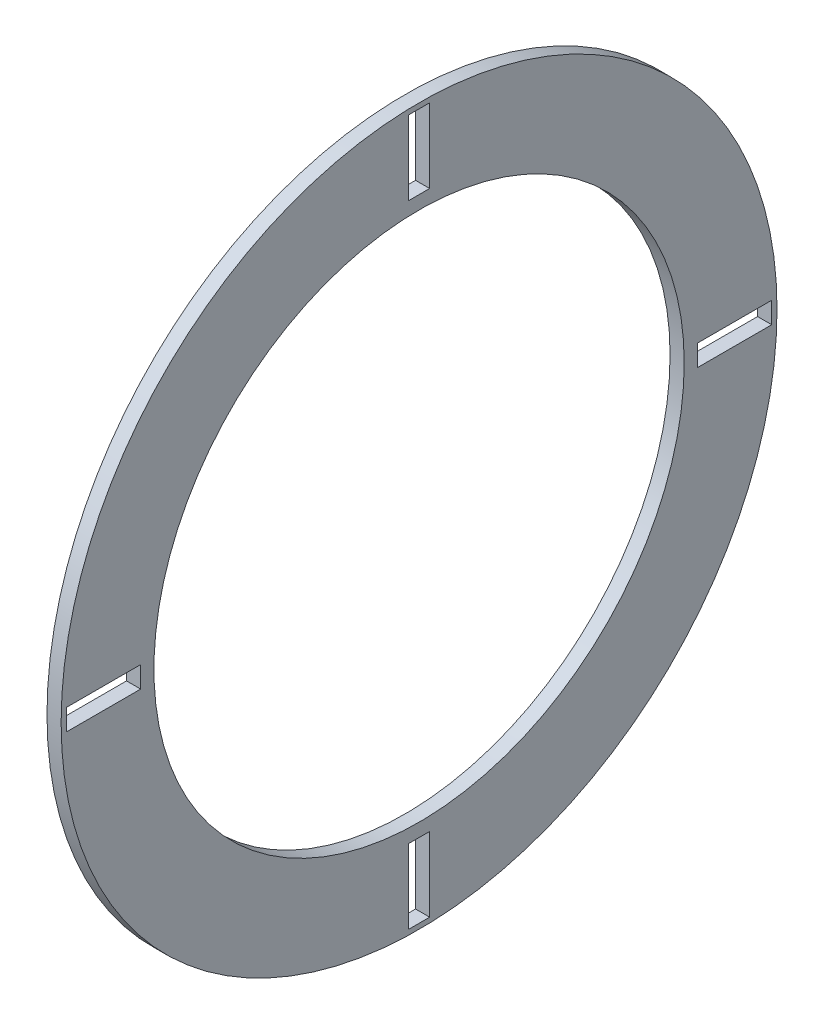
ISO-10303-21;
HEADER;
FILE_DESCRIPTION(('STEP AP214'),'2;1');
FILE_NAME('part.step','',(''),(''),'','','');
FILE_SCHEMA(('AUTOMOTIVE_DESIGN { 1 0 10303 214 1 1 1 1 }'));
ENDSEC;
DATA;
#1=APPLICATION_CONTEXT('core data for automotive mechanical design processes');
#2=APPLICATION_PROTOCOL_DEFINITION('international standard','automotive_design',2000,#1);
#3=PRODUCT_CONTEXT('',#1,'mechanical');
#4=PRODUCT('Part','Part','',(#3));
#5=PRODUCT_RELATED_PRODUCT_CATEGORY('part','',(#4));
#6=PRODUCT_DEFINITION_FORMATION('','',#4);
#7=PRODUCT_DEFINITION_CONTEXT('part definition',#1,'design');
#8=PRODUCT_DEFINITION('design','',#6,#7);
#9=PRODUCT_DEFINITION_SHAPE('','',#8);
#10=(LENGTH_UNIT() NAMED_UNIT(*) SI_UNIT(.MILLI.,.METRE.));
#11=(NAMED_UNIT(*) PLANE_ANGLE_UNIT() SI_UNIT($,.RADIAN.));
#12=(NAMED_UNIT(*) SI_UNIT($,.STERADIAN.) SOLID_ANGLE_UNIT());
#13=UNCERTAINTY_MEASURE_WITH_UNIT(LENGTH_MEASURE(1.E-05),#10,'distance_accuracy_value','');
#14=(GEOMETRIC_REPRESENTATION_CONTEXT(3) GLOBAL_UNCERTAINTY_ASSIGNED_CONTEXT((#13)) GLOBAL_UNIT_ASSIGNED_CONTEXT((#10,
#11,#12)) REPRESENTATION_CONTEXT('',''));
#15=CARTESIAN_POINT('',(0.,0.,0.));
#16=DIRECTION('',(0.,0.,1.));
#17=DIRECTION('',(1.,0.,0.));
#18=AXIS2_PLACEMENT_3D('',#15,#16,#17);
#19=CARTESIAN_POINT('',(0.66665,0.,58.75));
#20=DIRECTION('',(-1.,0.,0.));
#21=DIRECTION('',(0.,0.,1.));
#22=AXIS2_PLACEMENT_3D('',#19,#20,#21);
#23=PLANE('',#22);
#24=CARTESIAN_POINT('',(0.66665,0.,0.));
#25=DIRECTION('',(-1.,0.,0.));
#26=DIRECTION('',(0.,0.,1.));
#27=AXIS2_PLACEMENT_3D('',#24,#25,#26);
#28=CIRCLE('',#27,50.);
#29=CARTESIAN_POINT('',(0.66665,0.,-50.));
#30=VERTEX_POINT('',#29);
#31=EDGE_CURVE('E320',#30,#30,#28,.T.);
#32=ORIENTED_EDGE('',*,*,#31,.F.);
#33=EDGE_LOOP('',(#32));
#34=FACE_BOUND('',#33,.T.);
#35=DIRECTION('',(0.,1.,0.));
#36=VECTOR('',#35,1.);
#37=CARTESIAN_POINT('',(0.66665,0.,52.5));
#38=LINE('',#37,#36);
#39=CARTESIAN_POINT('',(0.66665,-2.,52.5));
#40=VERTEX_POINT('',#39);
#41=CARTESIAN_POINT('',(0.66665,2.,52.5));
#42=VERTEX_POINT('',#41);
#43=EDGE_CURVE('E250',#40,#42,#38,.T.);
#44=ORIENTED_EDGE('',*,*,#43,.T.);
#45=DIRECTION('',(0.,0.,1.));
#46=VECTOR('',#45,1.);
#47=CARTESIAN_POINT('',(0.66665,2.,59.125));
#48=LINE('',#47,#46);
#49=CARTESIAN_POINT('',(0.66665,2.,66.5));
#50=VERTEX_POINT('',#49);
#51=EDGE_CURVE('E242',#42,#50,#48,.T.);
#52=ORIENTED_EDGE('',*,*,#51,.T.);
#53=DIRECTION('',(0.,-1.,0.));
#54=VECTOR('',#53,1.);
#55=CARTESIAN_POINT('',(0.66665,0.,66.5));
#56=LINE('',#55,#54);
#57=CARTESIAN_POINT('',(0.66665,-2.,66.5));
#58=VERTEX_POINT('',#57);
#59=EDGE_CURVE('E200',#50,#58,#56,.T.);
#60=ORIENTED_EDGE('',*,*,#59,.T.);
#61=DIRECTION('',(0.,0.,-1.));
#62=VECTOR('',#61,1.);
#63=CARTESIAN_POINT('',(0.66665,-2.,59.125));
#64=LINE('',#63,#62);
#65=EDGE_CURVE('E10',#58,#40,#64,.T.);
#66=ORIENTED_EDGE('',*,*,#65,.T.);
#67=EDGE_LOOP('',(#44,#52,#60,#66));
#68=FACE_BOUND('',#67,.T.);
#69=DIRECTION('',(0.,0.,1.));
#70=VECTOR('',#69,1.);
#71=CARTESIAN_POINT('',(0.66665,-52.5,29.375));
#72=LINE('',#71,#70);
#73=CARTESIAN_POINT('',(0.66665,-52.5,-2.));
#74=VERTEX_POINT('',#73);
#75=CARTESIAN_POINT('',(0.66665,-52.5,2.));
#76=VERTEX_POINT('',#75);
#77=EDGE_CURVE('E196',#74,#76,#72,.T.);
#78=ORIENTED_EDGE('',*,*,#77,.T.);
#79=DIRECTION('',(0.,-1.,0.));
#80=VECTOR('',#79,1.);
#81=CARTESIAN_POINT('',(0.66665,-29.75,2.));
#82=LINE('',#81,#80);
#83=CARTESIAN_POINT('',(0.66665,-66.5,2.));
#84=VERTEX_POINT('',#83);
#85=EDGE_CURVE('E273',#76,#84,#82,.T.);
#86=ORIENTED_EDGE('',*,*,#85,.T.);
#87=DIRECTION('',(0.,0.,-1.));
#88=VECTOR('',#87,1.);
#89=CARTESIAN_POINT('',(0.66665,-66.5,29.375));
#90=LINE('',#89,#88);
#91=CARTESIAN_POINT('',(0.66665,-66.5,-2.));
#92=VERTEX_POINT('',#91);
#93=EDGE_CURVE('E179',#84,#92,#90,.T.);
#94=ORIENTED_EDGE('',*,*,#93,.T.);
#95=DIRECTION('',(0.,1.,0.));
#96=VECTOR('',#95,1.);
#97=CARTESIAN_POINT('',(0.66665,-29.75,-2.));
#98=LINE('',#97,#96);
#99=EDGE_CURVE('E169',#92,#74,#98,.T.);
#100=ORIENTED_EDGE('',*,*,#99,.T.);
#101=EDGE_LOOP('',(#78,#86,#94,#100));
#102=FACE_BOUND('',#101,.T.);
#103=DIRECTION('',(0.,-1.,0.));
#104=VECTOR('',#103,1.);
#105=CARTESIAN_POINT('',(0.66665,0.,-52.5));
#106=LINE('',#105,#104);
#107=CARTESIAN_POINT('',(0.66665,2.,-52.5));
#108=VERTEX_POINT('',#107);
#109=CARTESIAN_POINT('',(0.66665,-2.,-52.5));
#110=VERTEX_POINT('',#109);
#111=EDGE_CURVE('E303',#108,#110,#106,.T.);
#112=ORIENTED_EDGE('',*,*,#111,.T.);
#113=DIRECTION('',(0.,0.,-1.));
#114=VECTOR('',#113,1.);
#115=CARTESIAN_POINT('',(0.66665,-2.,-0.375));
#116=LINE('',#115,#114);
#117=CARTESIAN_POINT('',(0.66665,-2.,-66.5));
#118=VERTEX_POINT('',#117);
#119=EDGE_CURVE('E268',#110,#118,#116,.T.);
#120=ORIENTED_EDGE('',*,*,#119,.T.);
#121=DIRECTION('',(0.,1.,0.));
#122=VECTOR('',#121,1.);
#123=CARTESIAN_POINT('',(0.66665,0.,-66.5));
#124=LINE('',#123,#122);
#125=CARTESIAN_POINT('',(0.66665,2.,-66.5));
#126=VERTEX_POINT('',#125);
#127=EDGE_CURVE('E285',#118,#126,#124,.T.);
#128=ORIENTED_EDGE('',*,*,#127,.T.);
#129=DIRECTION('',(0.,0.,1.));
#130=VECTOR('',#129,1.);
#131=CARTESIAN_POINT('',(0.66665,2.,-0.375));
#132=LINE('',#131,#130);
#133=EDGE_CURVE('E184',#126,#108,#132,.T.);
#134=ORIENTED_EDGE('',*,*,#133,.T.);
#135=EDGE_LOOP('',(#112,#120,#128,#134));
#136=FACE_BOUND('',#135,.T.);
#137=DIRECTION('',(0.,0.,-1.));
#138=VECTOR('',#137,1.);
#139=CARTESIAN_POINT('',(0.66665,52.5,29.375));
#140=LINE('',#139,#138);
#141=CARTESIAN_POINT('',(0.66665,52.5,2.));
#142=VERTEX_POINT('',#141);
#143=CARTESIAN_POINT('',(0.66665,52.5,-2.));
#144=VERTEX_POINT('',#143);
#145=EDGE_CURVE('E209',#142,#144,#140,.T.);
#146=ORIENTED_EDGE('',*,*,#145,.T.);
#147=DIRECTION('',(0.,1.,0.));
#148=VECTOR('',#147,1.);
#149=CARTESIAN_POINT('',(0.66665,29.75,-2.));
#150=LINE('',#149,#148);
#151=CARTESIAN_POINT('',(0.66665,66.5,-2.));
#152=VERTEX_POINT('',#151);
#153=EDGE_CURVE('E194',#144,#152,#150,.T.);
#154=ORIENTED_EDGE('',*,*,#153,.T.);
#155=DIRECTION('',(0.,0.,1.));
#156=VECTOR('',#155,1.);
#157=CARTESIAN_POINT('',(0.66665,66.5,29.375));
#158=LINE('',#157,#156);
#159=CARTESIAN_POINT('',(0.66665,66.5,2.));
#160=VERTEX_POINT('',#159);
#161=EDGE_CURVE('E236',#152,#160,#158,.T.);
#162=ORIENTED_EDGE('',*,*,#161,.T.);
#163=DIRECTION('',(0.,-1.,0.));
#164=VECTOR('',#163,1.);
#165=CARTESIAN_POINT('',(0.66665,29.75,2.));
#166=LINE('',#165,#164);
#167=EDGE_CURVE('E20',#160,#142,#166,.T.);
#168=ORIENTED_EDGE('',*,*,#167,.T.);
#169=EDGE_LOOP('',(#146,#154,#162,#168));
#170=FACE_BOUND('',#169,.T.);
#171=CARTESIAN_POINT('',(0.66665,0.,0.));
#172=DIRECTION('',(-1.,0.,0.));
#173=DIRECTION('',(0.,0.,1.));
#174=AXIS2_PLACEMENT_3D('',#171,#172,#173);
#175=CIRCLE('',#174,67.5);
#176=CARTESIAN_POINT('',(0.66665,0.,-67.5));
#177=VERTEX_POINT('',#176);
#178=EDGE_CURVE('E262',#177,#177,#175,.T.);
#179=ORIENTED_EDGE('',*,*,#178,.T.);
#180=EDGE_LOOP('',(#179));
#181=FACE_BOUND('',#180,.T.);
#182=ADVANCED_FACE('F16',(#34,#68,#102,#136,#170,#181),#23,.T.);
#183=CARTESIAN_POINT('',(3.33335,0.,58.75));
#184=DIRECTION('',(1.,0.,0.));
#185=DIRECTION('',(0.,1.,0.));
#186=AXIS2_PLACEMENT_3D('',#183,#184,#185);
#187=PLANE('',#186);
#188=CARTESIAN_POINT('',(3.33335,0.,0.));
#189=DIRECTION('',(-1.,0.,0.));
#190=DIRECTION('',(0.,0.,1.));
#191=AXIS2_PLACEMENT_3D('',#188,#189,#190);
#192=CIRCLE('',#191,50.);
#193=CARTESIAN_POINT('',(3.33335,0.,-50.));
#194=VERTEX_POINT('',#193);
#195=EDGE_CURVE('E267',#194,#194,#192,.T.);
#196=ORIENTED_EDGE('',*,*,#195,.T.);
#197=EDGE_LOOP('',(#196));
#198=FACE_BOUND('',#197,.T.);
#199=DIRECTION('',(0.,-1.,0.));
#200=VECTOR('',#199,1.);
#201=CARTESIAN_POINT('',(3.33335,0.,52.5));
#202=LINE('',#201,#200);
#203=CARTESIAN_POINT('',(3.33335,2.,52.5));
#204=VERTEX_POINT('',#203);
#205=CARTESIAN_POINT('',(3.33335,-2.,52.5));
#206=VERTEX_POINT('',#205);
#207=EDGE_CURVE('E249',#204,#206,#202,.T.);
#208=ORIENTED_EDGE('',*,*,#207,.T.);
#209=DIRECTION('',(0.,0.,1.));
#210=VECTOR('',#209,1.);
#211=CARTESIAN_POINT('',(3.33335,-2.,59.125));
#212=LINE('',#211,#210);
#213=CARTESIAN_POINT('',(3.33335,-2.,66.5));
#214=VERTEX_POINT('',#213);
#215=EDGE_CURVE('E27',#206,#214,#212,.T.);
#216=ORIENTED_EDGE('',*,*,#215,.T.);
#217=DIRECTION('',(0.,1.,0.));
#218=VECTOR('',#217,1.);
#219=CARTESIAN_POINT('',(3.33335,0.,66.5));
#220=LINE('',#219,#218);
#221=CARTESIAN_POINT('',(3.33335,2.,66.5));
#222=VERTEX_POINT('',#221);
#223=EDGE_CURVE('E213',#214,#222,#220,.T.);
#224=ORIENTED_EDGE('',*,*,#223,.T.);
#225=DIRECTION('',(0.,0.,-1.));
#226=VECTOR('',#225,1.);
#227=CARTESIAN_POINT('',(3.33335,2.,59.125));
#228=LINE('',#227,#226);
#229=EDGE_CURVE('E239',#222,#204,#228,.T.);
#230=ORIENTED_EDGE('',*,*,#229,.T.);
#231=EDGE_LOOP('',(#208,#216,#224,#230));
#232=FACE_BOUND('',#231,.T.);
#233=DIRECTION('',(0.,0.,-1.));
#234=VECTOR('',#233,1.);
#235=CARTESIAN_POINT('',(3.33335,-52.5,29.375));
#236=LINE('',#235,#234);
#237=CARTESIAN_POINT('',(3.33335,-52.5,2.));
#238=VERTEX_POINT('',#237);
#239=CARTESIAN_POINT('',(3.33335,-52.5,-2.));
#240=VERTEX_POINT('',#239);
#241=EDGE_CURVE('E164',#238,#240,#236,.T.);
#242=ORIENTED_EDGE('',*,*,#241,.T.);
#243=DIRECTION('',(0.,-1.,0.));
#244=VECTOR('',#243,1.);
#245=CARTESIAN_POINT('',(3.33335,-29.75,-2.));
#246=LINE('',#245,#244);
#247=CARTESIAN_POINT('',(3.33335,-66.5,-2.));
#248=VERTEX_POINT('',#247);
#249=EDGE_CURVE('E157',#240,#248,#246,.T.);
#250=ORIENTED_EDGE('',*,*,#249,.T.);
#251=DIRECTION('',(0.,0.,1.));
#252=VECTOR('',#251,1.);
#253=CARTESIAN_POINT('',(3.33335,-66.5,29.375));
#254=LINE('',#253,#252);
#255=CARTESIAN_POINT('',(3.33335,-66.5,2.));
#256=VERTEX_POINT('',#255);
#257=EDGE_CURVE('E162',#248,#256,#254,.T.);
#258=ORIENTED_EDGE('',*,*,#257,.T.);
#259=DIRECTION('',(0.,1.,0.));
#260=VECTOR('',#259,1.);
#261=CARTESIAN_POINT('',(3.33335,-29.75,2.));
#262=LINE('',#261,#260);
#263=EDGE_CURVE('E145',#256,#238,#262,.T.);
#264=ORIENTED_EDGE('',*,*,#263,.T.);
#265=EDGE_LOOP('',(#242,#250,#258,#264));
#266=FACE_BOUND('',#265,.T.);
#267=DIRECTION('',(0.,1.,0.));
#268=VECTOR('',#267,1.);
#269=CARTESIAN_POINT('',(3.33335,0.,-52.5));
#270=LINE('',#269,#268);
#271=CARTESIAN_POINT('',(3.33335,-2.,-52.5));
#272=VERTEX_POINT('',#271);
#273=CARTESIAN_POINT('',(3.33335,2.,-52.5));
#274=VERTEX_POINT('',#273);
#275=EDGE_CURVE('E299',#272,#274,#270,.T.);
#276=ORIENTED_EDGE('',*,*,#275,.T.);
#277=DIRECTION('',(0.,0.,-1.));
#278=VECTOR('',#277,1.);
#279=CARTESIAN_POINT('',(3.33335,2.,-0.375));
#280=LINE('',#279,#278);
#281=CARTESIAN_POINT('',(3.33335,2.,-66.5));
#282=VERTEX_POINT('',#281);
#283=EDGE_CURVE('E190',#274,#282,#280,.T.);
#284=ORIENTED_EDGE('',*,*,#283,.T.);
#285=DIRECTION('',(0.,-1.,0.));
#286=VECTOR('',#285,1.);
#287=CARTESIAN_POINT('',(3.33335,0.,-66.5));
#288=LINE('',#287,#286);
#289=CARTESIAN_POINT('',(3.33335,-2.,-66.5));
#290=VERTEX_POINT('',#289);
#291=EDGE_CURVE('E286',#282,#290,#288,.T.);
#292=ORIENTED_EDGE('',*,*,#291,.T.);
#293=DIRECTION('',(0.,0.,1.));
#294=VECTOR('',#293,1.);
#295=CARTESIAN_POINT('',(3.33335,-2.,-0.375));
#296=LINE('',#295,#294);
#297=EDGE_CURVE('E272',#290,#272,#296,.T.);
#298=ORIENTED_EDGE('',*,*,#297,.T.);
#299=EDGE_LOOP('',(#276,#284,#292,#298));
#300=FACE_BOUND('',#299,.T.);
#301=DIRECTION('',(0.,0.,1.));
#302=VECTOR('',#301,1.);
#303=CARTESIAN_POINT('',(3.33335,52.5,29.375));
#304=LINE('',#303,#302);
#305=CARTESIAN_POINT('',(3.33335,52.5,-2.));
#306=VERTEX_POINT('',#305);
#307=CARTESIAN_POINT('',(3.33335,52.5,2.));
#308=VERTEX_POINT('',#307);
#309=EDGE_CURVE('E214',#306,#308,#304,.T.);
#310=ORIENTED_EDGE('',*,*,#309,.T.);
#311=DIRECTION('',(0.,1.,0.));
#312=VECTOR('',#311,1.);
#313=CARTESIAN_POINT('',(3.33335,29.75,2.));
#314=LINE('',#313,#312);
#315=CARTESIAN_POINT('',(3.33335,66.5,2.));
#316=VERTEX_POINT('',#315);
#317=EDGE_CURVE('E208',#308,#316,#314,.T.);
#318=ORIENTED_EDGE('',*,*,#317,.T.);
#319=DIRECTION('',(0.,0.,-1.));
#320=VECTOR('',#319,1.);
#321=CARTESIAN_POINT('',(3.33335,66.5,29.375));
#322=LINE('',#321,#320);
#323=CARTESIAN_POINT('',(3.33335,66.5,-2.));
#324=VERTEX_POINT('',#323);
#325=EDGE_CURVE('E261',#316,#324,#322,.T.);
#326=ORIENTED_EDGE('',*,*,#325,.T.);
#327=DIRECTION('',(0.,-1.,0.));
#328=VECTOR('',#327,1.);
#329=CARTESIAN_POINT('',(3.33335,29.75,-2.));
#330=LINE('',#329,#328);
#331=EDGE_CURVE('E118',#324,#306,#330,.T.);
#332=ORIENTED_EDGE('',*,*,#331,.T.);
#333=EDGE_LOOP('',(#310,#318,#326,#332));
#334=FACE_BOUND('',#333,.T.);
#335=CARTESIAN_POINT('',(3.33335,0.,0.));
#336=DIRECTION('',(-1.,0.,0.));
#337=DIRECTION('',(0.,0.,1.));
#338=AXIS2_PLACEMENT_3D('',#335,#336,#337);
#339=CIRCLE('',#338,67.5);
#340=CARTESIAN_POINT('',(3.33335,0.,-67.5));
#341=VERTEX_POINT('',#340);
#342=EDGE_CURVE('E266',#341,#341,#339,.T.);
#343=ORIENTED_EDGE('',*,*,#342,.F.);
#344=EDGE_LOOP('',(#343));
#345=FACE_BOUND('',#344,.T.);
#346=ADVANCED_FACE('F159',(#198,#232,#266,#300,#334,#345),#187,.T.);
#347=CARTESIAN_POINT('',(2.,-2.,59.5));
#348=DIRECTION('',(0.,1.,0.));
#349=DIRECTION('',(1.,0.,0.));
#350=AXIS2_PLACEMENT_3D('',#347,#348,#349);
#351=PLANE('',#350);
#352=ORIENTED_EDGE('',*,*,#215,.F.);
#353=DIRECTION('',(-1.,0.,0.));
#354=VECTOR('',#353,1.);
#355=CARTESIAN_POINT('',(2.,-2.,52.5));
#356=LINE('',#355,#354);
#357=EDGE_CURVE('E253',#206,#40,#356,.T.);
#358=ORIENTED_EDGE('',*,*,#357,.T.);
#359=ORIENTED_EDGE('',*,*,#65,.F.);
#360=DIRECTION('',(-1.,0.,0.));
#361=VECTOR('',#360,1.);
#362=CARTESIAN_POINT('',(2.,-2.,66.5));
#363=LINE('',#362,#361);
#364=EDGE_CURVE('E203',#214,#58,#363,.T.);
#365=ORIENTED_EDGE('',*,*,#364,.F.);
#366=EDGE_LOOP('',(#352,#358,#359,#365));
#367=FACE_BOUND('',#366,.T.);
#368=ADVANCED_FACE('F438',(#367),#351,.T.);
#369=CARTESIAN_POINT('',(2.,0.,52.5));
#370=DIRECTION('',(0.,0.,1.));
#371=DIRECTION('',(1.,0.,0.));
#372=AXIS2_PLACEMENT_3D('',#369,#370,#371);
#373=PLANE('',#372);
#374=ORIENTED_EDGE('',*,*,#207,.F.);
#375=DIRECTION('',(-1.,0.,0.));
#376=VECTOR('',#375,1.);
#377=CARTESIAN_POINT('',(2.,2.,52.5));
#378=LINE('',#377,#376);
#379=EDGE_CURVE('E245',#204,#42,#378,.T.);
#380=ORIENTED_EDGE('',*,*,#379,.T.);
#381=ORIENTED_EDGE('',*,*,#43,.F.);
#382=ORIENTED_EDGE('',*,*,#357,.F.);
#383=EDGE_LOOP('',(#374,#380,#381,#382));
#384=FACE_BOUND('',#383,.T.);
#385=ADVANCED_FACE('F463',(#384),#373,.T.);
#386=CARTESIAN_POINT('',(2.,2.,59.5));
#387=DIRECTION('',(0.,-1.,0.));
#388=DIRECTION('',(-1.,0.,0.));
#389=AXIS2_PLACEMENT_3D('',#386,#387,#388);
#390=PLANE('',#389);
#391=ORIENTED_EDGE('',*,*,#229,.F.);
#392=DIRECTION('',(-1.,0.,0.));
#393=VECTOR('',#392,1.);
#394=CARTESIAN_POINT('',(2.,2.,66.5));
#395=LINE('',#394,#393);
#396=EDGE_CURVE('E202',#222,#50,#395,.T.);
#397=ORIENTED_EDGE('',*,*,#396,.T.);
#398=ORIENTED_EDGE('',*,*,#51,.F.);
#399=ORIENTED_EDGE('',*,*,#379,.F.);
#400=EDGE_LOOP('',(#391,#397,#398,#399));
#401=FACE_BOUND('',#400,.T.);
#402=ADVANCED_FACE('F465',(#401),#390,.T.);
#403=CARTESIAN_POINT('',(2.,0.,66.5));
#404=DIRECTION('',(0.,0.,-1.));
#405=DIRECTION('',(0.,-1.,0.));
#406=AXIS2_PLACEMENT_3D('',#403,#404,#405);
#407=PLANE('',#406);
#408=ORIENTED_EDGE('',*,*,#223,.F.);
#409=ORIENTED_EDGE('',*,*,#364,.T.);
#410=ORIENTED_EDGE('',*,*,#59,.F.);
#411=ORIENTED_EDGE('',*,*,#396,.F.);
#412=EDGE_LOOP('',(#408,#409,#410,#411));
#413=FACE_BOUND('',#412,.T.);
#414=ADVANCED_FACE('F18',(#413),#407,.T.);
#415=CARTESIAN_POINT('',(2.,-59.5,-2.));
#416=DIRECTION('',(0.,0.,1.));
#417=DIRECTION('',(1.,0.,0.));
#418=AXIS2_PLACEMENT_3D('',#415,#416,#417);
#419=PLANE('',#418);
#420=ORIENTED_EDGE('',*,*,#249,.F.);
#421=DIRECTION('',(-1.,0.,0.));
#422=VECTOR('',#421,1.);
#423=CARTESIAN_POINT('',(2.,-52.5,-2.));
#424=LINE('',#423,#422);
#425=EDGE_CURVE('E170',#240,#74,#424,.T.);
#426=ORIENTED_EDGE('',*,*,#425,.T.);
#427=ORIENTED_EDGE('',*,*,#99,.F.);
#428=DIRECTION('',(-1.,0.,0.));
#429=VECTOR('',#428,1.);
#430=CARTESIAN_POINT('',(2.,-66.5,-2.));
#431=LINE('',#430,#429);
#432=EDGE_CURVE('E172',#248,#92,#431,.T.);
#433=ORIENTED_EDGE('',*,*,#432,.F.);
#434=EDGE_LOOP('',(#420,#426,#427,#433));
#435=FACE_BOUND('',#434,.T.);
#436=ADVANCED_FACE('F173',(#435),#419,.T.);
#437=CARTESIAN_POINT('',(2.,-52.5,0.));
#438=DIRECTION('',(0.,-1.,0.));
#439=DIRECTION('',(-1.,0.,0.));
#440=AXIS2_PLACEMENT_3D('',#437,#438,#439);
#441=PLANE('',#440);
#442=ORIENTED_EDGE('',*,*,#241,.F.);
#443=DIRECTION('',(-1.,0.,0.));
#444=VECTOR('',#443,1.);
#445=CARTESIAN_POINT('',(2.,-52.5,2.));
#446=LINE('',#445,#444);
#447=EDGE_CURVE('E197',#238,#76,#446,.T.);
#448=ORIENTED_EDGE('',*,*,#447,.T.);
#449=ORIENTED_EDGE('',*,*,#77,.F.);
#450=ORIENTED_EDGE('',*,*,#425,.F.);
#451=EDGE_LOOP('',(#442,#448,#449,#450));
#452=FACE_BOUND('',#451,.T.);
#453=ADVANCED_FACE('F396',(#452),#441,.T.);
#454=CARTESIAN_POINT('',(2.,-59.5,2.));
#455=DIRECTION('',(0.,0.,-1.));
#456=DIRECTION('',(0.,-1.,0.));
#457=AXIS2_PLACEMENT_3D('',#454,#455,#456);
#458=PLANE('',#457);
#459=ORIENTED_EDGE('',*,*,#263,.F.);
#460=DIRECTION('',(-1.,0.,0.));
#461=VECTOR('',#460,1.);
#462=CARTESIAN_POINT('',(2.,-66.5,2.));
#463=LINE('',#462,#461);
#464=EDGE_CURVE('E182',#256,#84,#463,.T.);
#465=ORIENTED_EDGE('',*,*,#464,.T.);
#466=ORIENTED_EDGE('',*,*,#85,.F.);
#467=ORIENTED_EDGE('',*,*,#447,.F.);
#468=EDGE_LOOP('',(#459,#465,#466,#467));
#469=FACE_BOUND('',#468,.T.);
#470=ADVANCED_FACE('F397',(#469),#458,.T.);
#471=CARTESIAN_POINT('',(2.,-66.5,0.));
#472=DIRECTION('',(0.,1.,0.));
#473=DIRECTION('',(1.,0.,0.));
#474=AXIS2_PLACEMENT_3D('',#471,#472,#473);
#475=PLANE('',#474);
#476=ORIENTED_EDGE('',*,*,#257,.F.);
#477=ORIENTED_EDGE('',*,*,#432,.T.);
#478=ORIENTED_EDGE('',*,*,#93,.F.);
#479=ORIENTED_EDGE('',*,*,#464,.F.);
#480=EDGE_LOOP('',(#476,#477,#478,#479));
#481=FACE_BOUND('',#480,.T.);
#482=ADVANCED_FACE('F181',(#481),#475,.T.);
#483=CARTESIAN_POINT('',(2.,2.,-59.5));
#484=DIRECTION('',(0.,-1.,0.));
#485=DIRECTION('',(-1.,0.,0.));
#486=AXIS2_PLACEMENT_3D('',#483,#484,#485);
#487=PLANE('',#486);
#488=ORIENTED_EDGE('',*,*,#283,.F.);
#489=DIRECTION('',(-1.,0.,0.));
#490=VECTOR('',#489,1.);
#491=CARTESIAN_POINT('',(2.,2.,-52.5));
#492=LINE('',#491,#490);
#493=EDGE_CURVE('E256',#274,#108,#492,.T.);
#494=ORIENTED_EDGE('',*,*,#493,.T.);
#495=ORIENTED_EDGE('',*,*,#133,.F.);
#496=DIRECTION('',(-1.,0.,0.));
#497=VECTOR('',#496,1.);
#498=CARTESIAN_POINT('',(2.,2.,-66.5));
#499=LINE('',#498,#497);
#500=EDGE_CURVE('E281',#282,#126,#499,.T.);
#501=ORIENTED_EDGE('',*,*,#500,.F.);
#502=EDGE_LOOP('',(#488,#494,#495,#501));
#503=FACE_BOUND('',#502,.T.);
#504=ADVANCED_FACE('F368',(#503),#487,.T.);
#505=CARTESIAN_POINT('',(2.,0.,-52.5));
#506=DIRECTION('',(0.,0.,-1.));
#507=DIRECTION('',(-1.,0.,0.));
#508=AXIS2_PLACEMENT_3D('',#505,#506,#507);
#509=PLANE('',#508);
#510=ORIENTED_EDGE('',*,*,#275,.F.);
#511=DIRECTION('',(-1.,0.,0.));
#512=VECTOR('',#511,1.);
#513=CARTESIAN_POINT('',(2.,-2.,-52.5));
#514=LINE('',#513,#512);
#515=EDGE_CURVE('E271',#272,#110,#514,.T.);
#516=ORIENTED_EDGE('',*,*,#515,.T.);
#517=ORIENTED_EDGE('',*,*,#111,.F.);
#518=ORIENTED_EDGE('',*,*,#493,.F.);
#519=EDGE_LOOP('',(#510,#516,#517,#518));
#520=FACE_BOUND('',#519,.T.);
#521=ADVANCED_FACE('F373',(#520),#509,.T.);
#522=CARTESIAN_POINT('',(2.,-2.,-59.5));
#523=DIRECTION('',(0.,1.,0.));
#524=DIRECTION('',(1.,0.,0.));
#525=AXIS2_PLACEMENT_3D('',#522,#523,#524);
#526=PLANE('',#525);
#527=ORIENTED_EDGE('',*,*,#297,.F.);
#528=DIRECTION('',(-1.,0.,0.));
#529=VECTOR('',#528,1.);
#530=CARTESIAN_POINT('',(2.,-2.,-66.5));
#531=LINE('',#530,#529);
#532=EDGE_CURVE('E280',#290,#118,#531,.T.);
#533=ORIENTED_EDGE('',*,*,#532,.T.);
#534=ORIENTED_EDGE('',*,*,#119,.F.);
#535=ORIENTED_EDGE('',*,*,#515,.F.);
#536=EDGE_LOOP('',(#527,#533,#534,#535));
#537=FACE_BOUND('',#536,.T.);
#538=ADVANCED_FACE('F456',(#537),#526,.T.);
#539=CARTESIAN_POINT('',(2.,0.,-66.5));
#540=DIRECTION('',(0.,0.,1.));
#541=DIRECTION('',(1.,0.,0.));
#542=AXIS2_PLACEMENT_3D('',#539,#540,#541);
#543=PLANE('',#542);
#544=ORIENTED_EDGE('',*,*,#291,.F.);
#545=ORIENTED_EDGE('',*,*,#500,.T.);
#546=ORIENTED_EDGE('',*,*,#127,.F.);
#547=ORIENTED_EDGE('',*,*,#532,.F.);
#548=EDGE_LOOP('',(#544,#545,#546,#547));
#549=FACE_BOUND('',#548,.T.);
#550=ADVANCED_FACE('F365',(#549),#543,.T.);
#551=CARTESIAN_POINT('',(2.,59.5,2.));
#552=DIRECTION('',(0.,0.,-1.));
#553=DIRECTION('',(0.,-1.,0.));
#554=AXIS2_PLACEMENT_3D('',#551,#552,#553);
#555=PLANE('',#554);
#556=ORIENTED_EDGE('',*,*,#317,.F.);
#557=DIRECTION('',(-1.,0.,0.));
#558=VECTOR('',#557,1.);
#559=CARTESIAN_POINT('',(2.,52.5,2.));
#560=LINE('',#559,#558);
#561=EDGE_CURVE('E205',#308,#142,#560,.T.);
#562=ORIENTED_EDGE('',*,*,#561,.T.);
#563=ORIENTED_EDGE('',*,*,#167,.F.);
#564=DIRECTION('',(-1.,0.,0.));
#565=VECTOR('',#564,1.);
#566=CARTESIAN_POINT('',(2.,66.5,2.));
#567=LINE('',#566,#565);
#568=EDGE_CURVE('E257',#316,#160,#567,.T.);
#569=ORIENTED_EDGE('',*,*,#568,.F.);
#570=EDGE_LOOP('',(#556,#562,#563,#569));
#571=FACE_BOUND('',#570,.T.);
#572=ADVANCED_FACE('F415',(#571),#555,.T.);
#573=CARTESIAN_POINT('',(2.,52.5,0.));
#574=DIRECTION('',(0.,1.,0.));
#575=DIRECTION('',(1.,0.,0.));
#576=AXIS2_PLACEMENT_3D('',#573,#574,#575);
#577=PLANE('',#576);
#578=ORIENTED_EDGE('',*,*,#309,.F.);
#579=DIRECTION('',(-1.,0.,0.));
#580=VECTOR('',#579,1.);
#581=CARTESIAN_POINT('',(2.,52.5,-2.));
#582=LINE('',#581,#580);
#583=EDGE_CURVE('E218',#306,#144,#582,.T.);
#584=ORIENTED_EDGE('',*,*,#583,.T.);
#585=ORIENTED_EDGE('',*,*,#145,.F.);
#586=ORIENTED_EDGE('',*,*,#561,.F.);
#587=EDGE_LOOP('',(#578,#584,#585,#586));
#588=FACE_BOUND('',#587,.T.);
#589=ADVANCED_FACE('F412',(#588),#577,.T.);
#590=CARTESIAN_POINT('',(2.,59.5,-2.));
#591=DIRECTION('',(0.,0.,1.));
#592=DIRECTION('',(1.,0.,0.));
#593=AXIS2_PLACEMENT_3D('',#590,#591,#592);
#594=PLANE('',#593);
#595=ORIENTED_EDGE('',*,*,#331,.F.);
#596=DIRECTION('',(-1.,0.,0.));
#597=VECTOR('',#596,1.);
#598=CARTESIAN_POINT('',(2.,66.5,-2.));
#599=LINE('',#598,#597);
#600=EDGE_CURVE('E229',#324,#152,#599,.T.);
#601=ORIENTED_EDGE('',*,*,#600,.T.);
#602=ORIENTED_EDGE('',*,*,#153,.F.);
#603=ORIENTED_EDGE('',*,*,#583,.F.);
#604=EDGE_LOOP('',(#595,#601,#602,#603));
#605=FACE_BOUND('',#604,.T.);
#606=ADVANCED_FACE('F419',(#605),#594,.T.);
#607=CARTESIAN_POINT('',(2.,66.5,0.));
#608=DIRECTION('',(0.,-1.,0.));
#609=DIRECTION('',(0.,0.,-1.));
#610=AXIS2_PLACEMENT_3D('',#607,#608,#609);
#611=PLANE('',#610);
#612=ORIENTED_EDGE('',*,*,#325,.F.);
#613=ORIENTED_EDGE('',*,*,#568,.T.);
#614=ORIENTED_EDGE('',*,*,#161,.F.);
#615=ORIENTED_EDGE('',*,*,#600,.F.);
#616=EDGE_LOOP('',(#612,#613,#614,#615));
#617=FACE_BOUND('',#616,.T.);
#618=ADVANCED_FACE('F418',(#617),#611,.T.);
#619=CARTESIAN_POINT('',(2.,0.,0.));
#620=DIRECTION('',(-1.,0.,0.));
#621=DIRECTION('',(0.,0.,1.));
#622=AXIS2_PLACEMENT_3D('',#619,#620,#621);
#623=CYLINDRICAL_SURFACE('',#622,67.5);
#624=ORIENTED_EDGE('',*,*,#342,.T.);
#625=EDGE_LOOP('',(#624));
#626=FACE_BOUND('',#625,.T.);
#627=ORIENTED_EDGE('',*,*,#178,.F.);
#628=EDGE_LOOP('',(#627));
#629=FACE_BOUND('',#628,.T.);
#630=ADVANCED_FACE('F427',(#626,#629),#623,.T.);
#631=CARTESIAN_POINT('',(2.,0.,0.));
#632=DIRECTION('',(-1.,0.,0.));
#633=DIRECTION('',(0.,0.,1.));
#634=AXIS2_PLACEMENT_3D('',#631,#632,#633);
#635=CYLINDRICAL_SURFACE('',#634,50.);
#636=ORIENTED_EDGE('',*,*,#195,.F.);
#637=EDGE_LOOP('',(#636));
#638=FACE_BOUND('',#637,.T.);
#639=ORIENTED_EDGE('',*,*,#31,.T.);
#640=EDGE_LOOP('',(#639));
#641=FACE_BOUND('',#640,.T.);
#642=ADVANCED_FACE('F459',(#638,#641),#635,.F.);
#643=CLOSED_SHELL('',(#182,#346,#368,#385,#402,#414,#436,#453,#470,#482,#504,#521,#538,#550,
#572,#589,#606,#618,#630,#642));
#644=MANIFOLD_SOLID_BREP('B1',#643);
#645=ADVANCED_BREP_SHAPE_REPRESENTATION('',(#18,#644),#14);
#646=SHAPE_DEFINITION_REPRESENTATION(#9,#645);
ENDSEC;
END-ISO-10303-21;
